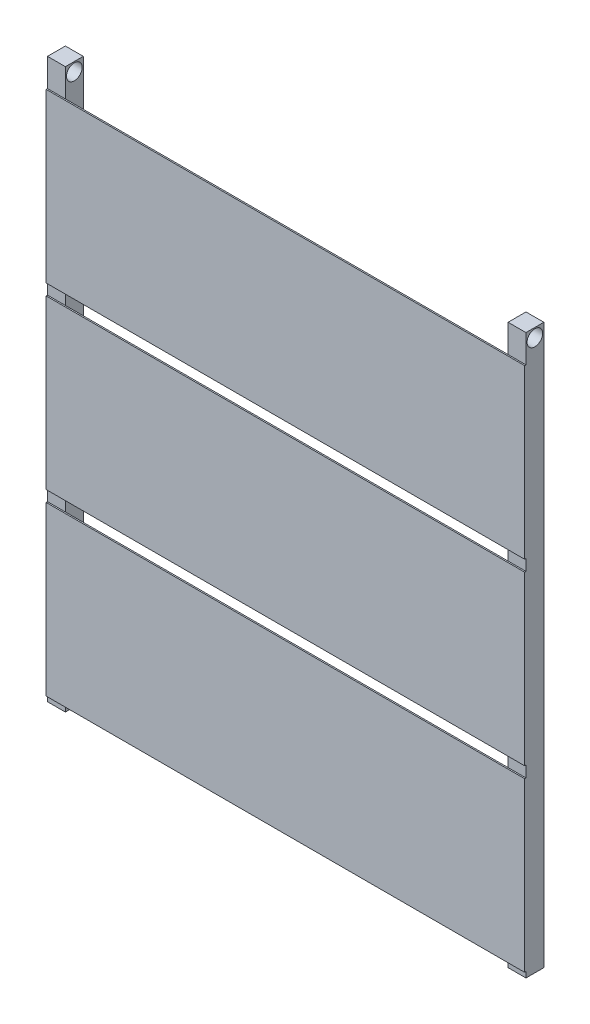
ISO-10303-21;
HEADER;
FILE_DESCRIPTION(('STEP AP214'),'2;1');
FILE_NAME('part.step','',(''),(''),'','','');
FILE_SCHEMA(('AUTOMOTIVE_DESIGN { 1 0 10303 214 1 1 1 1 }'));
ENDSEC;
DATA;
#1=APPLICATION_CONTEXT('core data for automotive mechanical design processes');
#2=APPLICATION_PROTOCOL_DEFINITION('international standard','automotive_design',2000,#1);
#3=PRODUCT_CONTEXT('',#1,'mechanical');
#4=PRODUCT('Part','Part','',(#3));
#5=PRODUCT_RELATED_PRODUCT_CATEGORY('part','',(#4));
#6=PRODUCT_DEFINITION_FORMATION('','',#4);
#7=PRODUCT_DEFINITION_CONTEXT('part definition',#1,'design');
#8=PRODUCT_DEFINITION('design','',#6,#7);
#9=PRODUCT_DEFINITION_SHAPE('','',#8);
#10=(LENGTH_UNIT() NAMED_UNIT(*) SI_UNIT(.MILLI.,.METRE.));
#11=(NAMED_UNIT(*) PLANE_ANGLE_UNIT() SI_UNIT($,.RADIAN.));
#12=(NAMED_UNIT(*) SI_UNIT($,.STERADIAN.) SOLID_ANGLE_UNIT());
#13=UNCERTAINTY_MEASURE_WITH_UNIT(LENGTH_MEASURE(1.E-05),#10,'distance_accuracy_value','');
#14=(GEOMETRIC_REPRESENTATION_CONTEXT(3) GLOBAL_UNCERTAINTY_ASSIGNED_CONTEXT((#13)) GLOBAL_UNIT_ASSIGNED_CONTEXT((#10,
#11,#12)) REPRESENTATION_CONTEXT('',''));
#15=CARTESIAN_POINT('',(0.,0.,0.));
#16=DIRECTION('',(0.,0.,1.));
#17=DIRECTION('',(1.,0.,0.));
#18=AXIS2_PLACEMENT_3D('',#15,#16,#17);
#19=CARTESIAN_POINT('',(214.,250.,11.4545454545454));
#20=DIRECTION('',(0.,0.,-1.));
#21=DIRECTION('',(-1.,0.,0.));
#22=AXIS2_PLACEMENT_3D('',#19,#20,#21);
#23=PLANE('',#22);
#24=DIRECTION('',(-1.,0.,0.));
#25=VECTOR('',#24,1.);
#26=CARTESIAN_POINT('',(-213.999999999997,-95.,11.4545454545455));
#27=LINE('',#26,#25);
#28=CARTESIAN_POINT('',(214.,-95.,11.4545454545454));
#29=VERTEX_POINT('',#28);
#30=CARTESIAN_POINT('',(198.,-95.,11.4545454545454));
#31=VERTEX_POINT('',#30);
#32=EDGE_CURVE('E76',#29,#31,#27,.T.);
#33=ORIENTED_EDGE('',*,*,#32,.F.);
#34=DIRECTION('',(0.,-1.,0.));
#35=VECTOR('',#34,1.);
#36=CARTESIAN_POINT('',(214.,250.,11.4545454545454));
#37=LINE('',#36,#35);
#38=CARTESIAN_POINT('',(214.,-85.,11.4545454545454));
#39=VERTEX_POINT('',#38);
#40=EDGE_CURVE('E211',#39,#29,#37,.T.);
#41=ORIENTED_EDGE('',*,*,#40,.F.);
#42=DIRECTION('',(1.,0.,0.));
#43=VECTOR('',#42,1.);
#44=CARTESIAN_POINT('',(-213.999999999998,-85.,11.4545454545455));
#45=LINE('',#44,#43);
#46=CARTESIAN_POINT('',(198.,-85.,11.4545454545455));
#47=VERTEX_POINT('',#46);
#48=EDGE_CURVE('E243',#47,#39,#45,.T.);
#49=ORIENTED_EDGE('',*,*,#48,.F.);
#50=DIRECTION('',(0.,-1.,0.));
#51=VECTOR('',#50,1.);
#52=CARTESIAN_POINT('',(198.,250.,11.4545454545454));
#53=LINE('',#52,#51);
#54=EDGE_CURVE('E393',#47,#31,#53,.T.);
#55=ORIENTED_EDGE('',*,*,#54,.T.);
#56=EDGE_LOOP('',(#33,#41,#49,#55));
#57=FACE_BOUND('',#56,.T.);
#58=ADVANCED_FACE('F49',(#57),#23,.F.);
#59=DIRECTION('',(1.,0.,0.));
#60=VECTOR('',#59,1.);
#61=CARTESIAN_POINT('',(-213.999999999997,-245.,11.4545454545455));
#62=LINE('',#61,#60);
#63=CARTESIAN_POINT('',(198.,-245.,11.4545454545455));
#64=VERTEX_POINT('',#63);
#65=CARTESIAN_POINT('',(214.,-245.,11.4545454545454));
#66=VERTEX_POINT('',#65);
#67=EDGE_CURVE('E471',#64,#66,#62,.T.);
#68=ORIENTED_EDGE('',*,*,#67,.F.);
#69=CARTESIAN_POINT('',(198.,-250.,11.4545454545454));
#70=VERTEX_POINT('',#69);
#71=EDGE_CURVE('E330',#64,#70,#53,.T.);
#72=ORIENTED_EDGE('',*,*,#71,.T.);
#73=DIRECTION('',(1.,0.,0.));
#74=VECTOR('',#73,1.);
#75=CARTESIAN_POINT('',(214.,-250.,11.4545454545454));
#76=LINE('',#75,#74);
#77=CARTESIAN_POINT('',(214.,-250.,11.4545454545454));
#78=VERTEX_POINT('',#77);
#79=EDGE_CURVE('E306',#70,#78,#76,.T.);
#80=ORIENTED_EDGE('',*,*,#79,.T.);
#81=EDGE_CURVE('E68',#66,#78,#37,.T.);
#82=ORIENTED_EDGE('',*,*,#81,.F.);
#83=EDGE_LOOP('',(#68,#72,#80,#82));
#84=FACE_BOUND('',#83,.T.);
#85=ADVANCED_FACE('F432',(#84),#23,.F.);
#86=DIRECTION('',(-1.,0.,0.));
#87=VECTOR('',#86,1.);
#88=CARTESIAN_POINT('',(-213.999999999998,65.,11.4545454545455));
#89=LINE('',#88,#87);
#90=CARTESIAN_POINT('',(214.,65.,11.4545454545454));
#91=VERTEX_POINT('',#90);
#92=CARTESIAN_POINT('',(198.,65.,11.4545454545454));
#93=VERTEX_POINT('',#92);
#94=EDGE_CURVE('E217',#91,#93,#89,.T.);
#95=ORIENTED_EDGE('',*,*,#94,.F.);
#96=CARTESIAN_POINT('',(214.,75.,11.4545454545454));
#97=VERTEX_POINT('',#96);
#98=EDGE_CURVE('E331',#97,#91,#37,.T.);
#99=ORIENTED_EDGE('',*,*,#98,.F.);
#100=DIRECTION('',(1.,0.,0.));
#101=VECTOR('',#100,1.);
#102=CARTESIAN_POINT('',(-214.,75.,11.4545454545455));
#103=LINE('',#102,#101);
#104=CARTESIAN_POINT('',(198.,75.,11.4545454545454));
#105=VERTEX_POINT('',#104);
#106=EDGE_CURVE('E12',#105,#97,#103,.T.);
#107=ORIENTED_EDGE('',*,*,#106,.F.);
#108=EDGE_CURVE('E380',#105,#93,#53,.T.);
#109=ORIENTED_EDGE('',*,*,#108,.T.);
#110=EDGE_LOOP('',(#95,#99,#107,#109));
#111=FACE_BOUND('',#110,.T.);
#112=ADVANCED_FACE('F379',(#111),#23,.F.);
#113=DIRECTION('',(-1.,0.,0.));
#114=VECTOR('',#113,1.);
#115=CARTESIAN_POINT('',(-214.,225.,11.4545454545455));
#116=LINE('',#115,#114);
#117=CARTESIAN_POINT('',(214.,225.,11.4545454545454));
#118=VERTEX_POINT('',#117);
#119=CARTESIAN_POINT('',(198.,225.,11.4545454545455));
#120=VERTEX_POINT('',#119);
#121=EDGE_CURVE('E276',#118,#120,#116,.T.);
#122=ORIENTED_EDGE('',*,*,#121,.F.);
#123=CARTESIAN_POINT('',(214.,250.,11.4545454545454));
#124=VERTEX_POINT('',#123);
#125=EDGE_CURVE('E326',#124,#118,#37,.T.);
#126=ORIENTED_EDGE('',*,*,#125,.F.);
#127=DIRECTION('',(1.,0.,0.));
#128=VECTOR('',#127,1.);
#129=CARTESIAN_POINT('',(214.,250.,11.4545454545454));
#130=LINE('',#129,#128);
#131=CARTESIAN_POINT('',(198.,250.,11.4545454545454));
#132=VERTEX_POINT('',#131);
#133=EDGE_CURVE('E312',#132,#124,#130,.T.);
#134=ORIENTED_EDGE('',*,*,#133,.F.);
#135=EDGE_CURVE('E332',#132,#120,#53,.T.);
#136=ORIENTED_EDGE('',*,*,#135,.T.);
#137=EDGE_LOOP('',(#122,#126,#134,#136));
#138=FACE_BOUND('',#137,.T.);
#139=ADVANCED_FACE('F437',(#138),#23,.F.);
#140=CARTESIAN_POINT('',(214.,250.,11.4545454545454));
#141=DIRECTION('',(-1.,0.,0.));
#142=DIRECTION('',(0.,0.,1.));
#143=AXIS2_PLACEMENT_3D('',#140,#141,#142);
#144=PLANE('',#143);
#145=CARTESIAN_POINT('',(214.000000000003,242.,3.45454545454541));
#146=DIRECTION('',(1.,0.,0.));
#147=DIRECTION('',(0.,0.,-1.));
#148=AXIS2_PLACEMENT_3D('',#145,#146,#147);
#149=CIRCLE('',#148,7.);
#150=CARTESIAN_POINT('',(214.000000000003,242.,10.4545454545454));
#151=VERTEX_POINT('',#150);
#152=EDGE_CURVE('E453',#151,#151,#149,.T.);
#153=ORIENTED_EDGE('',*,*,#152,.F.);
#154=EDGE_LOOP('',(#153));
#155=FACE_BOUND('',#154,.T.);
#156=DIRECTION('',(0.,0.,-1.));
#157=VECTOR('',#156,1.);
#158=CARTESIAN_POINT('',(214.,-250.,11.4545454545454));
#159=LINE('',#158,#157);
#160=CARTESIAN_POINT('',(214.,-250.,-4.54545454545459));
#161=VERTEX_POINT('',#160);
#162=EDGE_CURVE('E300',#78,#161,#159,.T.);
#163=ORIENTED_EDGE('',*,*,#162,.T.);
#164=DIRECTION('',(0.,-1.,0.));
#165=VECTOR('',#164,1.);
#166=CARTESIAN_POINT('',(214.,250.,-4.54545454545459));
#167=LINE('',#166,#165);
#168=CARTESIAN_POINT('',(214.,250.,-4.54545454545459));
#169=VERTEX_POINT('',#168);
#170=EDGE_CURVE('E59',#169,#161,#167,.T.);
#171=ORIENTED_EDGE('',*,*,#170,.F.);
#172=DIRECTION('',(0.,0.,-1.));
#173=VECTOR('',#172,1.);
#174=CARTESIAN_POINT('',(214.,250.,11.4545454545454));
#175=LINE('',#174,#173);
#176=EDGE_CURVE('E301',#124,#169,#175,.T.);
#177=ORIENTED_EDGE('',*,*,#176,.F.);
#178=ORIENTED_EDGE('',*,*,#125,.T.);
#179=DIRECTION('',(0.,0.,-1.));
#180=VECTOR('',#179,1.);
#181=CARTESIAN_POINT('',(214.,225.,12.6545454545455));
#182=LINE('',#181,#180);
#183=CARTESIAN_POINT('',(214.,225.,12.6545454545455));
#184=VERTEX_POINT('',#183);
#185=EDGE_CURVE('E296',#184,#118,#182,.T.);
#186=ORIENTED_EDGE('',*,*,#185,.F.);
#187=DIRECTION('',(0.,1.,0.));
#188=VECTOR('',#187,1.);
#189=CARTESIAN_POINT('',(214.,75.,12.6545454545455));
#190=LINE('',#189,#188);
#191=CARTESIAN_POINT('',(214.,75.,12.6545454545455));
#192=VERTEX_POINT('',#191);
#193=EDGE_CURVE('E262',#192,#184,#190,.T.);
#194=ORIENTED_EDGE('',*,*,#193,.F.);
#195=DIRECTION('',(0.,0.,-1.));
#196=VECTOR('',#195,1.);
#197=CARTESIAN_POINT('',(214.,75.,12.6545454545455));
#198=LINE('',#197,#196);
#199=EDGE_CURVE('E275',#192,#97,#198,.T.);
#200=ORIENTED_EDGE('',*,*,#199,.T.);
#201=ORIENTED_EDGE('',*,*,#98,.T.);
#202=DIRECTION('',(0.,0.,-1.));
#203=VECTOR('',#202,1.);
#204=CARTESIAN_POINT('',(214.000000000002,65.,12.6545454545455));
#205=LINE('',#204,#203);
#206=CARTESIAN_POINT('',(214.000000000002,65.,12.6545454545455));
#207=VERTEX_POINT('',#206);
#208=EDGE_CURVE('E257',#207,#91,#205,.T.);
#209=ORIENTED_EDGE('',*,*,#208,.F.);
#210=DIRECTION('',(0.,1.,0.));
#211=VECTOR('',#210,1.);
#212=CARTESIAN_POINT('',(214.000000000002,-85.,12.6545454545455));
#213=LINE('',#212,#211);
#214=CARTESIAN_POINT('',(214.000000000002,-85.,12.6545454545455));
#215=VERTEX_POINT('',#214);
#216=EDGE_CURVE('E223',#215,#207,#213,.T.);
#217=ORIENTED_EDGE('',*,*,#216,.F.);
#218=DIRECTION('',(0.,0.,-1.));
#219=VECTOR('',#218,1.);
#220=CARTESIAN_POINT('',(214.000000000002,-85.,12.6545454545455));
#221=LINE('',#220,#219);
#222=EDGE_CURVE('E236',#215,#39,#221,.T.);
#223=ORIENTED_EDGE('',*,*,#222,.T.);
#224=ORIENTED_EDGE('',*,*,#40,.T.);
#225=DIRECTION('',(0.,0.,-1.));
#226=VECTOR('',#225,1.);
#227=CARTESIAN_POINT('',(214.000000000003,-95.,12.6545454545455));
#228=LINE('',#227,#226);
#229=CARTESIAN_POINT('',(214.000000000003,-95.,12.6545454545455));
#230=VERTEX_POINT('',#229);
#231=EDGE_CURVE('E190',#230,#29,#228,.T.);
#232=ORIENTED_EDGE('',*,*,#231,.F.);
#233=DIRECTION('',(0.,1.,0.));
#234=VECTOR('',#233,1.);
#235=CARTESIAN_POINT('',(214.000000000003,-245.,12.6545454545455));
#236=LINE('',#235,#234);
#237=CARTESIAN_POINT('',(214.000000000003,-245.,12.6545454545455));
#238=VERTEX_POINT('',#237);
#239=EDGE_CURVE('E197',#238,#230,#236,.T.);
#240=ORIENTED_EDGE('',*,*,#239,.F.);
#241=DIRECTION('',(0.,0.,-1.));
#242=VECTOR('',#241,1.);
#243=CARTESIAN_POINT('',(214.000000000003,-245.,12.6545454545455));
#244=LINE('',#243,#242);
#245=EDGE_CURVE('E465',#238,#66,#244,.T.);
#246=ORIENTED_EDGE('',*,*,#245,.T.);
#247=ORIENTED_EDGE('',*,*,#81,.T.);
#248=EDGE_LOOP('',(#163,#171,#177,#178,#186,#194,#200,#201,#209,#217,#223,#224,#232,#240,#246,#247));
#249=FACE_BOUND('',#248,.T.);
#250=ADVANCED_FACE('F51',(#155,#249),#144,.F.);
#251=CARTESIAN_POINT('',(214.,250.,-4.54545454545459));
#252=DIRECTION('',(0.,0.,1.));
#253=DIRECTION('',(1.,0.,0.));
#254=AXIS2_PLACEMENT_3D('',#251,#252,#253);
#255=PLANE('',#254);
#256=DIRECTION('',(-1.,0.,0.));
#257=VECTOR('',#256,1.);
#258=CARTESIAN_POINT('',(214.,-250.,-4.54545454545459));
#259=LINE('',#258,#257);
#260=CARTESIAN_POINT('',(198.,-250.,-4.54545454545459));
#261=VERTEX_POINT('',#260);
#262=EDGE_CURVE('E317',#161,#261,#259,.T.);
#263=ORIENTED_EDGE('',*,*,#262,.T.);
#264=DIRECTION('',(0.,-1.,0.));
#265=VECTOR('',#264,1.);
#266=CARTESIAN_POINT('',(198.,250.,-4.54545454545459));
#267=LINE('',#266,#265);
#268=CARTESIAN_POINT('',(198.,250.,-4.54545454545459));
#269=VERTEX_POINT('',#268);
#270=EDGE_CURVE('E335',#269,#261,#267,.T.);
#271=ORIENTED_EDGE('',*,*,#270,.F.);
#272=DIRECTION('',(-1.,0.,0.));
#273=VECTOR('',#272,1.);
#274=CARTESIAN_POINT('',(214.,250.,-4.54545454545459));
#275=LINE('',#274,#273);
#276=EDGE_CURVE('E305',#169,#269,#275,.T.);
#277=ORIENTED_EDGE('',*,*,#276,.F.);
#278=ORIENTED_EDGE('',*,*,#170,.T.);
#279=EDGE_LOOP('',(#263,#271,#277,#278));
#280=FACE_BOUND('',#279,.T.);
#281=ADVANCED_FACE('F343',(#280),#255,.F.);
#282=CARTESIAN_POINT('',(198.,250.,11.4545454545454));
#283=DIRECTION('',(1.,0.,0.));
#284=DIRECTION('',(0.,0.,-1.));
#285=AXIS2_PLACEMENT_3D('',#282,#283,#284);
#286=PLANE('',#285);
#287=CARTESIAN_POINT('',(198.,242.,3.45454545454541));
#288=DIRECTION('',(1.,0.,0.));
#289=DIRECTION('',(0.,0.,-1.));
#290=AXIS2_PLACEMENT_3D('',#287,#288,#289);
#291=CIRCLE('',#290,7.);
#292=CARTESIAN_POINT('',(198.,242.,10.4545454545454));
#293=VERTEX_POINT('',#292);
#294=EDGE_CURVE('E53',#293,#293,#291,.F.);
#295=ORIENTED_EDGE('',*,*,#294,.F.);
#296=EDGE_LOOP('',(#295));
#297=FACE_BOUND('',#296,.T.);
#298=DIRECTION('',(0.,0.,1.));
#299=VECTOR('',#298,1.);
#300=CARTESIAN_POINT('',(198.,-250.,11.4545454545454));
#301=LINE('',#300,#299);
#302=EDGE_CURVE('E320',#261,#70,#301,.T.);
#303=ORIENTED_EDGE('',*,*,#302,.T.);
#304=ORIENTED_EDGE('',*,*,#71,.F.);
#305=EDGE_CURVE('E395',#31,#64,#53,.T.);
#306=ORIENTED_EDGE('',*,*,#305,.F.);
#307=ORIENTED_EDGE('',*,*,#54,.F.);
#308=EDGE_CURVE('E385',#93,#47,#53,.T.);
#309=ORIENTED_EDGE('',*,*,#308,.F.);
#310=ORIENTED_EDGE('',*,*,#108,.F.);
#311=EDGE_CURVE('E336',#120,#105,#53,.T.);
#312=ORIENTED_EDGE('',*,*,#311,.F.);
#313=ORIENTED_EDGE('',*,*,#135,.F.);
#314=DIRECTION('',(0.,0.,1.));
#315=VECTOR('',#314,1.);
#316=CARTESIAN_POINT('',(198.,250.,11.4545454545454));
#317=LINE('',#316,#315);
#318=EDGE_CURVE('E309',#269,#132,#317,.T.);
#319=ORIENTED_EDGE('',*,*,#318,.F.);
#320=ORIENTED_EDGE('',*,*,#270,.T.);
#321=EDGE_LOOP('',(#303,#304,#306,#307,#309,#310,#312,#313,#319,#320));
#322=FACE_BOUND('',#321,.T.);
#323=ADVANCED_FACE('F352',(#297,#322),#286,.F.);
#324=CARTESIAN_POINT('',(0.,250.,0.));
#325=DIRECTION('',(0.,1.,0.));
#326=DIRECTION('',(0.,0.,1.));
#327=AXIS2_PLACEMENT_3D('',#324,#325,#326);
#328=PLANE('',#327);
#329=ORIENTED_EDGE('',*,*,#176,.T.);
#330=ORIENTED_EDGE('',*,*,#276,.T.);
#331=ORIENTED_EDGE('',*,*,#318,.T.);
#332=ORIENTED_EDGE('',*,*,#133,.T.);
#333=EDGE_LOOP('',(#329,#330,#331,#332));
#334=FACE_BOUND('',#333,.T.);
#335=ADVANCED_FACE('F358',(#334),#328,.T.);
#336=CARTESIAN_POINT('',(0.,-250.,0.));
#337=DIRECTION('',(0.,1.,0.));
#338=DIRECTION('',(0.,0.,1.));
#339=AXIS2_PLACEMENT_3D('',#336,#337,#338);
#340=PLANE('',#339);
#341=ORIENTED_EDGE('',*,*,#162,.F.);
#342=ORIENTED_EDGE('',*,*,#79,.F.);
#343=ORIENTED_EDGE('',*,*,#302,.F.);
#344=ORIENTED_EDGE('',*,*,#262,.F.);
#345=EDGE_LOOP('',(#341,#342,#343,#344));
#346=FACE_BOUND('',#345,.T.);
#347=ADVANCED_FACE('F349',(#346),#340,.F.);
#348=CARTESIAN_POINT('',(-214.,225.,12.6545454545455));
#349=DIRECTION('',(0.,-1.,0.));
#350=DIRECTION('',(0.,0.,-1.));
#351=AXIS2_PLACEMENT_3D('',#348,#349,#350);
#352=PLANE('',#351);
#353=ORIENTED_EDGE('',*,*,#121,.T.);
#354=CARTESIAN_POINT('',(-214.,225.,11.4545454545455));
#355=VERTEX_POINT('',#354);
#356=EDGE_CURVE('E261',#120,#355,#116,.T.);
#357=ORIENTED_EDGE('',*,*,#356,.T.);
#358=DIRECTION('',(0.,0.,-1.));
#359=VECTOR('',#358,1.);
#360=CARTESIAN_POINT('',(-214.,225.,12.6545454545455));
#361=LINE('',#360,#359);
#362=CARTESIAN_POINT('',(-214.,225.,12.6545454545455));
#363=VERTEX_POINT('',#362);
#364=EDGE_CURVE('E292',#363,#355,#361,.T.);
#365=ORIENTED_EDGE('',*,*,#364,.F.);
#366=DIRECTION('',(-1.,0.,0.));
#367=VECTOR('',#366,1.);
#368=CARTESIAN_POINT('',(-214.,225.,12.6545454545455));
#369=LINE('',#368,#367);
#370=EDGE_CURVE('E266',#184,#363,#369,.T.);
#371=ORIENTED_EDGE('',*,*,#370,.F.);
#372=ORIENTED_EDGE('',*,*,#185,.T.);
#373=EDGE_LOOP('',(#353,#357,#365,#371,#372));
#374=FACE_BOUND('',#373,.T.);
#375=ADVANCED_FACE('F364',(#374),#352,.F.);
#376=CARTESIAN_POINT('',(-214.,75.,12.6545454545455));
#377=DIRECTION('',(1.,0.,0.));
#378=DIRECTION('',(0.,0.,-1.));
#379=AXIS2_PLACEMENT_3D('',#376,#377,#378);
#380=PLANE('',#379);
#381=DIRECTION('',(0.,-1.,0.));
#382=VECTOR('',#381,1.);
#383=CARTESIAN_POINT('',(-214.,75.,11.4545454545455));
#384=LINE('',#383,#382);
#385=CARTESIAN_POINT('',(-214.,75.,11.4545454545455));
#386=VERTEX_POINT('',#385);
#387=EDGE_CURVE('E280',#355,#386,#384,.T.);
#388=ORIENTED_EDGE('',*,*,#387,.T.);
#389=DIRECTION('',(0.,0.,-1.));
#390=VECTOR('',#389,1.);
#391=CARTESIAN_POINT('',(-214.,75.,12.6545454545455));
#392=LINE('',#391,#390);
#393=CARTESIAN_POINT('',(-214.,75.,12.6545454545455));
#394=VERTEX_POINT('',#393);
#395=EDGE_CURVE('E288',#394,#386,#392,.T.);
#396=ORIENTED_EDGE('',*,*,#395,.F.);
#397=DIRECTION('',(0.,-1.,0.));
#398=VECTOR('',#397,1.);
#399=CARTESIAN_POINT('',(-214.,75.,12.6545454545455));
#400=LINE('',#399,#398);
#401=EDGE_CURVE('E269',#363,#394,#400,.T.);
#402=ORIENTED_EDGE('',*,*,#401,.F.);
#403=ORIENTED_EDGE('',*,*,#364,.T.);
#404=EDGE_LOOP('',(#388,#396,#402,#403));
#405=FACE_BOUND('',#404,.T.);
#406=ADVANCED_FACE('F514',(#405),#380,.F.);
#407=CARTESIAN_POINT('',(-214.,75.,12.6545454545455));
#408=DIRECTION('',(0.,1.,0.));
#409=DIRECTION('',(0.,0.,1.));
#410=AXIS2_PLACEMENT_3D('',#407,#408,#409);
#411=PLANE('',#410);
#412=EDGE_CURVE('E61',#386,#105,#103,.T.);
#413=ORIENTED_EDGE('',*,*,#412,.T.);
#414=ORIENTED_EDGE('',*,*,#106,.T.);
#415=ORIENTED_EDGE('',*,*,#199,.F.);
#416=DIRECTION('',(1.,0.,0.));
#417=VECTOR('',#416,1.);
#418=CARTESIAN_POINT('',(-214.,75.,12.6545454545455));
#419=LINE('',#418,#417);
#420=EDGE_CURVE('E272',#394,#192,#419,.T.);
#421=ORIENTED_EDGE('',*,*,#420,.F.);
#422=ORIENTED_EDGE('',*,*,#395,.T.);
#423=EDGE_LOOP('',(#413,#414,#415,#421,#422));
#424=FACE_BOUND('',#423,.T.);
#425=ADVANCED_FACE('F374',(#424),#411,.F.);
#426=CARTESIAN_POINT('',(0.,0.,12.6545454545455));
#427=DIRECTION('',(0.,0.,-1.));
#428=DIRECTION('',(-1.,0.,0.));
#429=AXIS2_PLACEMENT_3D('',#426,#427,#428);
#430=PLANE('',#429);
#431=ORIENTED_EDGE('',*,*,#193,.T.);
#432=ORIENTED_EDGE('',*,*,#370,.T.);
#433=ORIENTED_EDGE('',*,*,#401,.T.);
#434=ORIENTED_EDGE('',*,*,#420,.T.);
#435=EDGE_LOOP('',(#431,#432,#433,#434));
#436=FACE_BOUND('',#435,.T.);
#437=ADVANCED_FACE('F368',(#436),#430,.F.);
#438=CARTESIAN_POINT('',(0.,0.,11.4545454545455));
#439=DIRECTION('',(0.,0.,-1.));
#440=DIRECTION('',(-1.,0.,0.));
#441=AXIS2_PLACEMENT_3D('',#438,#439,#440);
#442=PLANE('',#441);
#443=ORIENTED_EDGE('',*,*,#356,.F.);
#444=ORIENTED_EDGE('',*,*,#311,.T.);
#445=ORIENTED_EDGE('',*,*,#412,.F.);
#446=ORIENTED_EDGE('',*,*,#387,.F.);
#447=EDGE_LOOP('',(#443,#444,#445,#446));
#448=FACE_BOUND('',#447,.T.);
#449=ADVANCED_FACE('F388',(#448),#442,.T.);
#450=CARTESIAN_POINT('',(0.,0.,11.4545454545455));
#451=DIRECTION('',(0.,0.,-1.));
#452=DIRECTION('',(-1.,0.,0.));
#453=AXIS2_PLACEMENT_3D('',#450,#451,#452);
#454=PLANE('',#453);
#455=ORIENTED_EDGE('',*,*,#308,.T.);
#456=CARTESIAN_POINT('',(-213.999999999998,-85.,11.4545454545455));
#457=VERTEX_POINT('',#456);
#458=EDGE_CURVE('E228',#457,#47,#45,.T.);
#459=ORIENTED_EDGE('',*,*,#458,.F.);
#460=DIRECTION('',(0.,-1.,0.));
#461=VECTOR('',#460,1.);
#462=CARTESIAN_POINT('',(-213.999999999998,-85.,11.4545454545455));
#463=LINE('',#462,#461);
#464=CARTESIAN_POINT('',(-213.999999999998,65.,11.4545454545455));
#465=VERTEX_POINT('',#464);
#466=EDGE_CURVE('E240',#465,#457,#463,.T.);
#467=ORIENTED_EDGE('',*,*,#466,.F.);
#468=EDGE_CURVE('E213',#93,#465,#89,.T.);
#469=ORIENTED_EDGE('',*,*,#468,.F.);
#470=EDGE_LOOP('',(#455,#459,#467,#469));
#471=FACE_BOUND('',#470,.T.);
#472=ADVANCED_FACE('F419',(#471),#454,.T.);
#473=CARTESIAN_POINT('',(-213.999999999998,65.,12.6545454545455));
#474=DIRECTION('',(0.,-1.,0.));
#475=DIRECTION('',(0.,0.,-1.));
#476=AXIS2_PLACEMENT_3D('',#473,#474,#475);
#477=PLANE('',#476);
#478=ORIENTED_EDGE('',*,*,#94,.T.);
#479=ORIENTED_EDGE('',*,*,#468,.T.);
#480=DIRECTION('',(0.,0.,-1.));
#481=VECTOR('',#480,1.);
#482=CARTESIAN_POINT('',(-213.999999999998,65.,12.6545454545455));
#483=LINE('',#482,#481);
#484=CARTESIAN_POINT('',(-213.999999999998,65.,12.6545454545455));
#485=VERTEX_POINT('',#484);
#486=EDGE_CURVE('E253',#485,#465,#483,.T.);
#487=ORIENTED_EDGE('',*,*,#486,.F.);
#488=DIRECTION('',(-1.,0.,0.));
#489=VECTOR('',#488,1.);
#490=CARTESIAN_POINT('',(-213.999999999998,65.,12.6545454545455));
#491=LINE('',#490,#489);
#492=EDGE_CURVE('E227',#207,#485,#491,.T.);
#493=ORIENTED_EDGE('',*,*,#492,.F.);
#494=ORIENTED_EDGE('',*,*,#208,.T.);
#495=EDGE_LOOP('',(#478,#479,#487,#493,#494));
#496=FACE_BOUND('',#495,.T.);
#497=ADVANCED_FACE('F421',(#496),#477,.F.);
#498=CARTESIAN_POINT('',(-213.999999999998,-85.,12.6545454545455));
#499=DIRECTION('',(1.,0.,0.));
#500=DIRECTION('',(0.,0.,-1.));
#501=AXIS2_PLACEMENT_3D('',#498,#499,#500);
#502=PLANE('',#501);
#503=ORIENTED_EDGE('',*,*,#466,.T.);
#504=DIRECTION('',(0.,0.,-1.));
#505=VECTOR('',#504,1.);
#506=CARTESIAN_POINT('',(-213.999999999998,-85.,12.6545454545455));
#507=LINE('',#506,#505);
#508=CARTESIAN_POINT('',(-213.999999999998,-85.,12.6545454545455));
#509=VERTEX_POINT('',#508);
#510=EDGE_CURVE('E249',#509,#457,#507,.T.);
#511=ORIENTED_EDGE('',*,*,#510,.F.);
#512=DIRECTION('',(0.,-1.,0.));
#513=VECTOR('',#512,1.);
#514=CARTESIAN_POINT('',(-213.999999999998,-85.,12.6545454545455));
#515=LINE('',#514,#513);
#516=EDGE_CURVE('E231',#485,#509,#515,.T.);
#517=ORIENTED_EDGE('',*,*,#516,.F.);
#518=ORIENTED_EDGE('',*,*,#486,.T.);
#519=EDGE_LOOP('',(#503,#511,#517,#518));
#520=FACE_BOUND('',#519,.T.);
#521=ADVANCED_FACE('F422',(#520),#502,.F.);
#522=CARTESIAN_POINT('',(-213.999999999998,-85.,12.6545454545455));
#523=DIRECTION('',(0.,1.,0.));
#524=DIRECTION('',(0.,0.,1.));
#525=AXIS2_PLACEMENT_3D('',#522,#523,#524);
#526=PLANE('',#525);
#527=ORIENTED_EDGE('',*,*,#458,.T.);
#528=ORIENTED_EDGE('',*,*,#48,.T.);
#529=ORIENTED_EDGE('',*,*,#222,.F.);
#530=DIRECTION('',(1.,0.,0.));
#531=VECTOR('',#530,1.);
#532=CARTESIAN_POINT('',(-213.999999999998,-85.,12.6545454545455));
#533=LINE('',#532,#531);
#534=EDGE_CURVE('E234',#509,#215,#533,.T.);
#535=ORIENTED_EDGE('',*,*,#534,.F.);
#536=ORIENTED_EDGE('',*,*,#510,.T.);
#537=EDGE_LOOP('',(#527,#528,#529,#535,#536));
#538=FACE_BOUND('',#537,.T.);
#539=ADVANCED_FACE('F407',(#538),#526,.F.);
#540=CARTESIAN_POINT('',(0.,0.,12.6545454545455));
#541=DIRECTION('',(0.,0.,-1.));
#542=DIRECTION('',(-1.,0.,0.));
#543=AXIS2_PLACEMENT_3D('',#540,#541,#542);
#544=PLANE('',#543);
#545=ORIENTED_EDGE('',*,*,#216,.T.);
#546=ORIENTED_EDGE('',*,*,#492,.T.);
#547=ORIENTED_EDGE('',*,*,#516,.T.);
#548=ORIENTED_EDGE('',*,*,#534,.T.);
#549=EDGE_LOOP('',(#545,#546,#547,#548));
#550=FACE_BOUND('',#549,.T.);
#551=ADVANCED_FACE('F412',(#550),#544,.F.);
#552=CARTESIAN_POINT('',(0.,0.,11.4545454545455));
#553=DIRECTION('',(0.,0.,-1.));
#554=DIRECTION('',(-1.,0.,0.));
#555=AXIS2_PLACEMENT_3D('',#552,#553,#554);
#556=PLANE('',#555);
#557=ORIENTED_EDGE('',*,*,#305,.T.);
#558=CARTESIAN_POINT('',(-213.999999999997,-245.,11.4545454545455));
#559=VERTEX_POINT('',#558);
#560=EDGE_CURVE('E207',#559,#64,#62,.T.);
#561=ORIENTED_EDGE('',*,*,#560,.F.);
#562=DIRECTION('',(0.,-1.,0.));
#563=VECTOR('',#562,1.);
#564=CARTESIAN_POINT('',(-213.999999999997,-245.,11.4545454545455));
#565=LINE('',#564,#563);
#566=CARTESIAN_POINT('',(-213.999999999997,-95.,11.4545454545455));
#567=VERTEX_POINT('',#566);
#568=EDGE_CURVE('E468',#567,#559,#565,.T.);
#569=ORIENTED_EDGE('',*,*,#568,.F.);
#570=EDGE_CURVE('E459',#31,#567,#27,.T.);
#571=ORIENTED_EDGE('',*,*,#570,.F.);
#572=EDGE_LOOP('',(#557,#561,#569,#571));
#573=FACE_BOUND('',#572,.T.);
#574=ADVANCED_FACE('F485',(#573),#556,.T.);
#575=CARTESIAN_POINT('',(-213.999999999997,-95.,12.6545454545455));
#576=DIRECTION('',(0.,-1.,0.));
#577=DIRECTION('',(0.,0.,-1.));
#578=AXIS2_PLACEMENT_3D('',#575,#576,#577);
#579=PLANE('',#578);
#580=ORIENTED_EDGE('',*,*,#32,.T.);
#581=ORIENTED_EDGE('',*,*,#570,.T.);
#582=DIRECTION('',(0.,0.,-1.));
#583=VECTOR('',#582,1.);
#584=CARTESIAN_POINT('',(-213.999999999997,-95.,12.6545454545455));
#585=LINE('',#584,#583);
#586=CARTESIAN_POINT('',(-213.999999999997,-95.,12.6545454545455));
#587=VERTEX_POINT('',#586);
#588=EDGE_CURVE('E192',#587,#567,#585,.T.);
#589=ORIENTED_EDGE('',*,*,#588,.F.);
#590=DIRECTION('',(-1.,0.,0.));
#591=VECTOR('',#590,1.);
#592=CARTESIAN_POINT('',(-213.999999999997,-95.,12.6545454545455));
#593=LINE('',#592,#591);
#594=EDGE_CURVE('E186',#230,#587,#593,.T.);
#595=ORIENTED_EDGE('',*,*,#594,.F.);
#596=ORIENTED_EDGE('',*,*,#231,.T.);
#597=EDGE_LOOP('',(#580,#581,#589,#595,#596));
#598=FACE_BOUND('',#597,.T.);
#599=ADVANCED_FACE('F188',(#598),#579,.F.);
#600=CARTESIAN_POINT('',(-213.999999999997,-245.,12.6545454545455));
#601=DIRECTION('',(1.,0.,0.));
#602=DIRECTION('',(0.,0.,-1.));
#603=AXIS2_PLACEMENT_3D('',#600,#601,#602);
#604=PLANE('',#603);
#605=ORIENTED_EDGE('',*,*,#568,.T.);
#606=DIRECTION('',(0.,0.,-1.));
#607=VECTOR('',#606,1.);
#608=CARTESIAN_POINT('',(-213.999999999997,-245.,12.6545454545455));
#609=LINE('',#608,#607);
#610=CARTESIAN_POINT('',(-213.999999999997,-245.,12.6545454545455));
#611=VERTEX_POINT('',#610);
#612=EDGE_CURVE('E219',#611,#559,#609,.T.);
#613=ORIENTED_EDGE('',*,*,#612,.F.);
#614=DIRECTION('',(0.,-1.,0.));
#615=VECTOR('',#614,1.);
#616=CARTESIAN_POINT('',(-213.999999999997,-245.,12.6545454545455));
#617=LINE('',#616,#615);
#618=EDGE_CURVE('E196',#587,#611,#617,.T.);
#619=ORIENTED_EDGE('',*,*,#618,.F.);
#620=ORIENTED_EDGE('',*,*,#588,.T.);
#621=EDGE_LOOP('',(#605,#613,#619,#620));
#622=FACE_BOUND('',#621,.T.);
#623=ADVANCED_FACE('F489',(#622),#604,.F.);
#624=CARTESIAN_POINT('',(-213.999999999997,-245.,12.6545454545455));
#625=DIRECTION('',(0.,1.,0.));
#626=DIRECTION('',(0.,0.,1.));
#627=AXIS2_PLACEMENT_3D('',#624,#625,#626);
#628=PLANE('',#627);
#629=ORIENTED_EDGE('',*,*,#560,.T.);
#630=ORIENTED_EDGE('',*,*,#67,.T.);
#631=ORIENTED_EDGE('',*,*,#245,.F.);
#632=DIRECTION('',(1.,0.,0.));
#633=VECTOR('',#632,1.);
#634=CARTESIAN_POINT('',(-213.999999999997,-245.,12.6545454545455));
#635=LINE('',#634,#633);
#636=EDGE_CURVE('E202',#611,#238,#635,.T.);
#637=ORIENTED_EDGE('',*,*,#636,.F.);
#638=ORIENTED_EDGE('',*,*,#612,.T.);
#639=EDGE_LOOP('',(#629,#630,#631,#637,#638));
#640=FACE_BOUND('',#639,.T.);
#641=ADVANCED_FACE('F481',(#640),#628,.F.);
#642=CARTESIAN_POINT('',(0.,0.,12.6545454545455));
#643=DIRECTION('',(0.,0.,-1.));
#644=DIRECTION('',(-1.,0.,0.));
#645=AXIS2_PLACEMENT_3D('',#642,#643,#644);
#646=PLANE('',#645);
#647=ORIENTED_EDGE('',*,*,#239,.T.);
#648=ORIENTED_EDGE('',*,*,#594,.T.);
#649=ORIENTED_EDGE('',*,*,#618,.T.);
#650=ORIENTED_EDGE('',*,*,#636,.T.);
#651=EDGE_LOOP('',(#647,#648,#649,#650));
#652=FACE_BOUND('',#651,.T.);
#653=ADVANCED_FACE('F200',(#652),#646,.F.);
#654=CARTESIAN_POINT('',(214.000000000003,242.,3.45454545454541));
#655=DIRECTION('',(-1.,0.,0.));
#656=DIRECTION('',(0.,0.,1.));
#657=AXIS2_PLACEMENT_3D('',#654,#655,#656);
#658=CYLINDRICAL_SURFACE('',#657,7.);
#659=CARTESIAN_POINT('',(214.000000000003,242.,10.4545454545454));
#660=CARTESIAN_POINT('',(213.833333333337,242.,10.4545454545454));
#661=CARTESIAN_POINT('',(213.66666666667,242.,10.4545454545454));
#662=CARTESIAN_POINT('',(213.333333333337,242.,10.4545454545454));
#663=CARTESIAN_POINT('',(213.16666666667,242.,10.4545454545454));
#664=CARTESIAN_POINT('',(212.833333333337,242.,10.4545454545454));
#665=CARTESIAN_POINT('',(212.66666666667,242.,10.4545454545454));
#666=CARTESIAN_POINT('',(212.333333333336,242.,10.4545454545454));
#667=CARTESIAN_POINT('',(212.16666666667,242.,10.4545454545454));
#668=CARTESIAN_POINT('',(211.833333333336,242.,10.4545454545454));
#669=CARTESIAN_POINT('',(211.66666666667,242.,10.4545454545454));
#670=CARTESIAN_POINT('',(211.333333333336,242.,10.4545454545454));
#671=CARTESIAN_POINT('',(211.16666666667,242.,10.4545454545454));
#672=CARTESIAN_POINT('',(210.833333333336,242.,10.4545454545454));
#673=CARTESIAN_POINT('',(210.666666666669,242.,10.4545454545454));
#674=CARTESIAN_POINT('',(210.333333333336,242.,10.4545454545454));
#675=CARTESIAN_POINT('',(210.166666666669,242.,10.4545454545454));
#676=CARTESIAN_POINT('',(209.833333333336,242.,10.4545454545454));
#677=CARTESIAN_POINT('',(209.666666666669,242.,10.4545454545454));
#678=CARTESIAN_POINT('',(209.333333333336,242.,10.4545454545454));
#679=CARTESIAN_POINT('',(209.166666666669,242.,10.4545454545454));
#680=CARTESIAN_POINT('',(208.833333333336,242.,10.4545454545454));
#681=CARTESIAN_POINT('',(208.666666666669,242.,10.4545454545454));
#682=CARTESIAN_POINT('',(208.333333333336,242.,10.4545454545454));
#683=CARTESIAN_POINT('',(208.166666666669,242.,10.4545454545454));
#684=CARTESIAN_POINT('',(207.833333333335,242.,10.4545454545454));
#685=CARTESIAN_POINT('',(207.666666666669,242.,10.4545454545454));
#686=CARTESIAN_POINT('',(207.333333333335,242.,10.4545454545454));
#687=CARTESIAN_POINT('',(207.166666666669,242.,10.4545454545454));
#688=CARTESIAN_POINT('',(206.833333333335,242.,10.4545454545454));
#689=CARTESIAN_POINT('',(206.666666666669,242.,10.4545454545454));
#690=CARTESIAN_POINT('',(206.333333333335,242.,10.4545454545454));
#691=CARTESIAN_POINT('',(206.166666666668,242.,10.4545454545454));
#692=CARTESIAN_POINT('',(205.833333333335,242.,10.4545454545454));
#693=CARTESIAN_POINT('',(205.666666666668,242.,10.4545454545454));
#694=CARTESIAN_POINT('',(205.333333333335,242.,10.4545454545454));
#695=CARTESIAN_POINT('',(205.166666666668,242.,10.4545454545454));
#696=CARTESIAN_POINT('',(204.833333333335,242.,10.4545454545454));
#697=CARTESIAN_POINT('',(204.666666666668,242.,10.4545454545454));
#698=CARTESIAN_POINT('',(204.333333333335,242.,10.4545454545454));
#699=CARTESIAN_POINT('',(204.166666666668,242.,10.4545454545454));
#700=CARTESIAN_POINT('',(203.833333333335,242.,10.4545454545454));
#701=CARTESIAN_POINT('',(203.666666666668,242.,10.4545454545454));
#702=CARTESIAN_POINT('',(203.333333333335,242.,10.4545454545454));
#703=CARTESIAN_POINT('',(203.166666666668,242.,10.4545454545454));
#704=CARTESIAN_POINT('',(202.833333333334,242.,10.4545454545454));
#705=CARTESIAN_POINT('',(202.666666666668,242.,10.4545454545454));
#706=CARTESIAN_POINT('',(202.333333333334,242.,10.4545454545454));
#707=CARTESIAN_POINT('',(202.166666666668,242.,10.4545454545454));
#708=CARTESIAN_POINT('',(201.833333333334,242.,10.4545454545454));
#709=CARTESIAN_POINT('',(201.666666666667,242.,10.4545454545454));
#710=CARTESIAN_POINT('',(201.333333333334,242.,10.4545454545454));
#711=CARTESIAN_POINT('',(201.166666666667,242.,10.4545454545454));
#712=CARTESIAN_POINT('',(200.833333333334,242.,10.4545454545454));
#713=CARTESIAN_POINT('',(200.666666666667,242.,10.4545454545454));
#714=CARTESIAN_POINT('',(200.333333333334,242.,10.4545454545454));
#715=CARTESIAN_POINT('',(200.166666666667,242.,10.4545454545454));
#716=CARTESIAN_POINT('',(199.833333333334,242.,10.4545454545454));
#717=CARTESIAN_POINT('',(199.666666666667,242.,10.4545454545454));
#718=CARTESIAN_POINT('',(199.333333333334,242.,10.4545454545454));
#719=CARTESIAN_POINT('',(199.166666666667,242.,10.4545454545454));
#720=CARTESIAN_POINT('',(198.833333333334,242.,10.4545454545454));
#721=CARTESIAN_POINT('',(198.666666666667,242.,10.4545454545454));
#722=CARTESIAN_POINT('',(198.333333333333,242.,10.4545454545454));
#723=CARTESIAN_POINT('',(198.166666666667,242.,10.4545454545454));
#724=CARTESIAN_POINT('',(198.,242.,10.4545454545454));
#725=B_SPLINE_CURVE_WITH_KNOTS('',3,(#659,#660,#661,#662,#663,#664,#665,#666,#667,#668,#669,
#670,#671,#672,#673,#674,#675,#676,#677,#678,#679,#680,#681,#682,#683,#684,#685,#686,#687,#688,
#689,#690,#691,#692,#693,#694,#695,#696,#697,#698,#699,#700,#701,#702,#703,#704,#705,#706,#707,
#708,#709,#710,#711,#712,#713,#714,#715,#716,#717,#718,#719,#720,#721,#722,#723,#724),
.UNSPECIFIED.,.F.,.F.,(4,2,2,2,2,2,2,2,2,2,2,2,2,2,2,2,2,2,2,2,2,2,2,2,2,2,2,2,2,2,2,2,4),(0.,
0.500000000000111,1.00000000000022,1.50000000000033,2.00000000000045,2.50000000000056,
3.00000000000064,3.50000000000075,4.00000000000086,4.50000000000098,5.00000000000109,
5.50000000000117,6.00000000000128,6.50000000000139,7.0000000000015,7.50000000000162,
8.00000000000173,8.50000000000181,9.00000000000192,9.50000000000203,10.0000000000021,
10.5000000000023,11.0000000000023,11.5000000000025,12.0000000000026,12.5000000000027,
13.0000000000028,13.5000000000029,14.000000000003,14.5000000000031,15.0000000000032,
15.5000000000033,16.0000000000034),.UNSPECIFIED.);
#726=EDGE_CURVE('BSEAM604',#151,#293,#725,.T.);
#727=ORIENTED_EDGE('',*,*,#152,.T.);
#728=ORIENTED_EDGE('',*,*,#294,.T.);
#729=ORIENTED_EDGE('',*,*,#726,.T.);
#730=ORIENTED_EDGE('',*,*,#726,.F.);
#731=EDGE_LOOP('',(#727,#729,#728,#730));
#732=FACE_BOUND('',#731,.T.);
#733=ADVANCED_FACE('F604',(#732),#658,.F.);
#734=CLOSED_SHELL('',(#58,#85,#112,#139,#250,#281,#323,#335,#347,#375,#406,#425,#437,#449,#472,
#497,#521,#539,#551,#574,#599,#623,#641,#653,#733));
#735=MANIFOLD_SOLID_BREP('B2',#734);
#736=CARTESIAN_POINT('',(-198.,250.,11.4545454545455));
#737=DIRECTION('',(-1.,0.,0.));
#738=DIRECTION('',(0.,0.,1.));
#739=AXIS2_PLACEMENT_3D('',#736,#737,#738);
#740=PLANE('',#739);
#741=CARTESIAN_POINT('',(-198.,242.,3.45454545454541));
#742=DIRECTION('',(-1.,0.,0.));
#743=DIRECTION('',(0.,0.,1.));
#744=AXIS2_PLACEMENT_3D('',#741,#742,#743);
#745=CIRCLE('',#744,7.);
#746=CARTESIAN_POINT('',(-198.,242.,10.4545454545454));
#747=VERTEX_POINT('',#746);
#748=EDGE_CURVE('E745',#747,#747,#745,.F.);
#749=ORIENTED_EDGE('',*,*,#748,.F.);
#750=EDGE_LOOP('',(#749));
#751=FACE_BOUND('',#750,.T.);
#752=DIRECTION('',(0.,0.,-1.));
#753=VECTOR('',#752,1.);
#754=CARTESIAN_POINT('',(-198.,-250.,11.4545454545455));
#755=LINE('',#754,#753);
#756=CARTESIAN_POINT('',(-198.,-250.,11.4545454545455));
#757=VERTEX_POINT('',#756);
#758=CARTESIAN_POINT('',(-198.,-250.,-4.54545454545454));
#759=VERTEX_POINT('',#758);
#760=EDGE_CURVE('E742',#757,#759,#755,.T.);
#761=ORIENTED_EDGE('',*,*,#760,.T.);
#762=DIRECTION('',(0.,-1.,0.));
#763=VECTOR('',#762,1.);
#764=CARTESIAN_POINT('',(-198.,250.,-4.54545454545454));
#765=LINE('',#764,#763);
#766=CARTESIAN_POINT('',(-198.,250.,-4.54545454545454));
#767=VERTEX_POINT('',#766);
#768=EDGE_CURVE('E47',#767,#759,#765,.T.);
#769=ORIENTED_EDGE('',*,*,#768,.F.);
#770=DIRECTION('',(0.,0.,-1.));
#771=VECTOR('',#770,1.);
#772=CARTESIAN_POINT('',(-198.,250.,11.4545454545455));
#773=LINE('',#772,#771);
#774=CARTESIAN_POINT('',(-198.,250.,11.4545454545455));
#775=VERTEX_POINT('',#774);
#776=EDGE_CURVE('E730',#775,#767,#773,.T.);
#777=ORIENTED_EDGE('',*,*,#776,.F.);
#778=DIRECTION('',(0.,-1.,0.));
#779=VECTOR('',#778,1.);
#780=CARTESIAN_POINT('',(-198.,250.,11.4545454545455));
#781=LINE('',#780,#779);
#782=EDGE_CURVE('E738',#775,#757,#781,.T.);
#783=ORIENTED_EDGE('',*,*,#782,.T.);
#784=EDGE_LOOP('',(#761,#769,#777,#783));
#785=FACE_BOUND('',#784,.T.);
#786=ADVANCED_FACE('F679',(#751,#785),#740,.F.);
#787=CARTESIAN_POINT('',(-214.,250.,-4.54545454545454));
#788=DIRECTION('',(0.,0.,1.));
#789=DIRECTION('',(1.,0.,0.));
#790=AXIS2_PLACEMENT_3D('',#787,#788,#789);
#791=PLANE('',#790);
#792=DIRECTION('',(-1.,0.,0.));
#793=VECTOR('',#792,1.);
#794=CARTESIAN_POINT('',(-214.,-250.,-4.54545454545454));
#795=LINE('',#794,#793);
#796=CARTESIAN_POINT('',(-214.,-250.,-4.54545454545454));
#797=VERTEX_POINT('',#796);
#798=EDGE_CURVE('E734',#759,#797,#795,.T.);
#799=ORIENTED_EDGE('',*,*,#798,.T.);
#800=DIRECTION('',(0.,-1.,0.));
#801=VECTOR('',#800,1.);
#802=CARTESIAN_POINT('',(-214.,250.,-4.54545454545454));
#803=LINE('',#802,#801);
#804=CARTESIAN_POINT('',(-214.,250.,-4.54545454545454));
#805=VERTEX_POINT('',#804);
#806=EDGE_CURVE('E687',#805,#797,#803,.T.);
#807=ORIENTED_EDGE('',*,*,#806,.F.);
#808=DIRECTION('',(-1.,0.,0.));
#809=VECTOR('',#808,1.);
#810=CARTESIAN_POINT('',(-214.,250.,-4.54545454545454));
#811=LINE('',#810,#809);
#812=EDGE_CURVE('E725',#767,#805,#811,.T.);
#813=ORIENTED_EDGE('',*,*,#812,.F.);
#814=ORIENTED_EDGE('',*,*,#768,.T.);
#815=EDGE_LOOP('',(#799,#807,#813,#814));
#816=FACE_BOUND('',#815,.T.);
#817=ADVANCED_FACE('F733',(#816),#791,.F.);
#818=CARTESIAN_POINT('',(-214.,250.,11.4545454545455));
#819=DIRECTION('',(1.,0.,0.));
#820=DIRECTION('',(0.,0.,-1.));
#821=AXIS2_PLACEMENT_3D('',#818,#819,#820);
#822=PLANE('',#821);
#823=CARTESIAN_POINT('',(-214.,242.,3.45454545454541));
#824=DIRECTION('',(1.,0.,0.));
#825=DIRECTION('',(0.,0.,-1.));
#826=AXIS2_PLACEMENT_3D('',#823,#824,#825);
#827=CIRCLE('',#826,7.);
#828=CARTESIAN_POINT('',(-214.,242.,10.4545454545454));
#829=VERTEX_POINT('',#828);
#830=EDGE_CURVE('E758',#829,#829,#827,.T.);
#831=ORIENTED_EDGE('',*,*,#830,.T.);
#832=EDGE_LOOP('',(#831));
#833=FACE_BOUND('',#832,.T.);
#834=DIRECTION('',(0.,0.,1.));
#835=VECTOR('',#834,1.);
#836=CARTESIAN_POINT('',(-214.,-250.,11.4545454545455));
#837=LINE('',#836,#835);
#838=CARTESIAN_POINT('',(-214.,-250.,11.4545454545455));
#839=VERTEX_POINT('',#838);
#840=EDGE_CURVE('E712',#797,#839,#837,.T.);
#841=ORIENTED_EDGE('',*,*,#840,.T.);
#842=DIRECTION('',(0.,-1.,0.));
#843=VECTOR('',#842,1.);
#844=CARTESIAN_POINT('',(-214.,250.,11.4545454545455));
#845=LINE('',#844,#843);
#846=CARTESIAN_POINT('',(-214.,250.,11.4545454545455));
#847=VERTEX_POINT('',#846);
#848=EDGE_CURVE('E735',#847,#839,#845,.T.);
#849=ORIENTED_EDGE('',*,*,#848,.F.);
#850=DIRECTION('',(0.,0.,1.));
#851=VECTOR('',#850,1.);
#852=CARTESIAN_POINT('',(-214.,250.,11.4545454545455));
#853=LINE('',#852,#851);
#854=EDGE_CURVE('E728',#805,#847,#853,.T.);
#855=ORIENTED_EDGE('',*,*,#854,.F.);
#856=ORIENTED_EDGE('',*,*,#806,.T.);
#857=EDGE_LOOP('',(#841,#849,#855,#856));
#858=FACE_BOUND('',#857,.T.);
#859=ADVANCED_FACE('F736',(#833,#858),#822,.F.);
#860=CARTESIAN_POINT('',(-214.,250.,11.4545454545455));
#861=DIRECTION('',(0.,0.,-1.));
#862=DIRECTION('',(-1.,0.,0.));
#863=AXIS2_PLACEMENT_3D('',#860,#861,#862);
#864=PLANE('',#863);
#865=DIRECTION('',(1.,0.,0.));
#866=VECTOR('',#865,1.);
#867=CARTESIAN_POINT('',(-214.,-250.,11.4545454545455));
#868=LINE('',#867,#866);
#869=EDGE_CURVE('E718',#839,#757,#868,.T.);
#870=ORIENTED_EDGE('',*,*,#869,.T.);
#871=ORIENTED_EDGE('',*,*,#782,.F.);
#872=DIRECTION('',(1.,0.,0.));
#873=VECTOR('',#872,1.);
#874=CARTESIAN_POINT('',(-214.,250.,11.4545454545455));
#875=LINE('',#874,#873);
#876=EDGE_CURVE('E695',#847,#775,#875,.T.);
#877=ORIENTED_EDGE('',*,*,#876,.F.);
#878=ORIENTED_EDGE('',*,*,#848,.T.);
#879=EDGE_LOOP('',(#870,#871,#877,#878));
#880=FACE_BOUND('',#879,.T.);
#881=ADVANCED_FACE('F750',(#880),#864,.F.);
#882=CARTESIAN_POINT('',(0.,250.,0.));
#883=DIRECTION('',(0.,-1.,0.));
#884=DIRECTION('',(0.,0.,-1.));
#885=AXIS2_PLACEMENT_3D('',#882,#883,#884);
#886=PLANE('',#885);
#887=ORIENTED_EDGE('',*,*,#776,.T.);
#888=ORIENTED_EDGE('',*,*,#812,.T.);
#889=ORIENTED_EDGE('',*,*,#854,.T.);
#890=ORIENTED_EDGE('',*,*,#876,.T.);
#891=EDGE_LOOP('',(#887,#888,#889,#890));
#892=FACE_BOUND('',#891,.T.);
#893=ADVANCED_FACE('F726',(#892),#886,.F.);
#894=CARTESIAN_POINT('',(0.,-250.,0.));
#895=DIRECTION('',(0.,-1.,0.));
#896=DIRECTION('',(0.,0.,-1.));
#897=AXIS2_PLACEMENT_3D('',#894,#895,#896);
#898=PLANE('',#897);
#899=ORIENTED_EDGE('',*,*,#760,.F.);
#900=ORIENTED_EDGE('',*,*,#869,.F.);
#901=ORIENTED_EDGE('',*,*,#840,.F.);
#902=ORIENTED_EDGE('',*,*,#798,.F.);
#903=EDGE_LOOP('',(#899,#900,#901,#902));
#904=FACE_BOUND('',#903,.T.);
#905=ADVANCED_FACE('F753',(#904),#898,.T.);
#906=CARTESIAN_POINT('',(214.000000000003,242.,3.45454545454541));
#907=DIRECTION('',(-1.,0.,0.));
#908=DIRECTION('',(0.,0.,1.));
#909=AXIS2_PLACEMENT_3D('',#906,#907,#908);
#910=CYLINDRICAL_SURFACE('',#909,7.);
#911=CARTESIAN_POINT('',(-214.,242.,10.4545454545454));
#912=CARTESIAN_POINT('',(-213.833333333333,242.,10.4545454545454));
#913=CARTESIAN_POINT('',(-213.666666666667,242.,10.4545454545454));
#914=CARTESIAN_POINT('',(-213.333333333333,242.,10.4545454545454));
#915=CARTESIAN_POINT('',(-213.166666666667,242.,10.4545454545454));
#916=CARTESIAN_POINT('',(-212.833333333333,242.,10.4545454545454));
#917=CARTESIAN_POINT('',(-212.666666666667,242.,10.4545454545454));
#918=CARTESIAN_POINT('',(-212.333333333333,242.,10.4545454545454));
#919=CARTESIAN_POINT('',(-212.166666666667,242.,10.4545454545454));
#920=CARTESIAN_POINT('',(-211.833333333333,242.,10.4545454545454));
#921=CARTESIAN_POINT('',(-211.666666666667,242.,10.4545454545454));
#922=CARTESIAN_POINT('',(-211.333333333333,242.,10.4545454545454));
#923=CARTESIAN_POINT('',(-211.166666666667,242.,10.4545454545454));
#924=CARTESIAN_POINT('',(-210.833333333333,242.,10.4545454545454));
#925=CARTESIAN_POINT('',(-210.666666666667,242.,10.4545454545454));
#926=CARTESIAN_POINT('',(-210.333333333333,242.,10.4545454545454));
#927=CARTESIAN_POINT('',(-210.166666666667,242.,10.4545454545454));
#928=CARTESIAN_POINT('',(-209.833333333333,242.,10.4545454545454));
#929=CARTESIAN_POINT('',(-209.666666666667,242.,10.4545454545454));
#930=CARTESIAN_POINT('',(-209.333333333333,242.,10.4545454545454));
#931=CARTESIAN_POINT('',(-209.166666666667,242.,10.4545454545454));
#932=CARTESIAN_POINT('',(-208.833333333333,242.,10.4545454545454));
#933=CARTESIAN_POINT('',(-208.666666666667,242.,10.4545454545454));
#934=CARTESIAN_POINT('',(-208.333333333333,242.,10.4545454545454));
#935=CARTESIAN_POINT('',(-208.166666666667,242.,10.4545454545454));
#936=CARTESIAN_POINT('',(-207.833333333333,242.,10.4545454545454));
#937=CARTESIAN_POINT('',(-207.666666666667,242.,10.4545454545454));
#938=CARTESIAN_POINT('',(-207.333333333333,242.,10.4545454545454));
#939=CARTESIAN_POINT('',(-207.166666666667,242.,10.4545454545454));
#940=CARTESIAN_POINT('',(-206.833333333333,242.,10.4545454545454));
#941=CARTESIAN_POINT('',(-206.666666666667,242.,10.4545454545454));
#942=CARTESIAN_POINT('',(-206.333333333333,242.,10.4545454545454));
#943=CARTESIAN_POINT('',(-206.166666666667,242.,10.4545454545454));
#944=CARTESIAN_POINT('',(-205.833333333333,242.,10.4545454545454));
#945=CARTESIAN_POINT('',(-205.666666666667,242.,10.4545454545454));
#946=CARTESIAN_POINT('',(-205.333333333333,242.,10.4545454545454));
#947=CARTESIAN_POINT('',(-205.166666666667,242.,10.4545454545454));
#948=CARTESIAN_POINT('',(-204.833333333333,242.,10.4545454545454));
#949=CARTESIAN_POINT('',(-204.666666666667,242.,10.4545454545454));
#950=CARTESIAN_POINT('',(-204.333333333333,242.,10.4545454545454));
#951=CARTESIAN_POINT('',(-204.166666666667,242.,10.4545454545454));
#952=CARTESIAN_POINT('',(-203.833333333333,242.,10.4545454545454));
#953=CARTESIAN_POINT('',(-203.666666666667,242.,10.4545454545454));
#954=CARTESIAN_POINT('',(-203.333333333333,242.,10.4545454545454));
#955=CARTESIAN_POINT('',(-203.166666666667,242.,10.4545454545454));
#956=CARTESIAN_POINT('',(-202.833333333333,242.,10.4545454545454));
#957=CARTESIAN_POINT('',(-202.666666666667,242.,10.4545454545454));
#958=CARTESIAN_POINT('',(-202.333333333333,242.,10.4545454545454));
#959=CARTESIAN_POINT('',(-202.166666666667,242.,10.4545454545454));
#960=CARTESIAN_POINT('',(-201.833333333333,242.,10.4545454545454));
#961=CARTESIAN_POINT('',(-201.666666666667,242.,10.4545454545454));
#962=CARTESIAN_POINT('',(-201.333333333333,242.,10.4545454545454));
#963=CARTESIAN_POINT('',(-201.166666666667,242.,10.4545454545454));
#964=CARTESIAN_POINT('',(-200.833333333333,242.,10.4545454545454));
#965=CARTESIAN_POINT('',(-200.666666666667,242.,10.4545454545454));
#966=CARTESIAN_POINT('',(-200.333333333333,242.,10.4545454545454));
#967=CARTESIAN_POINT('',(-200.166666666667,242.,10.4545454545454));
#968=CARTESIAN_POINT('',(-199.833333333333,242.,10.4545454545454));
#969=CARTESIAN_POINT('',(-199.666666666667,242.,10.4545454545454));
#970=CARTESIAN_POINT('',(-199.333333333333,242.,10.4545454545454));
#971=CARTESIAN_POINT('',(-199.166666666667,242.,10.4545454545454));
#972=CARTESIAN_POINT('',(-198.833333333333,242.,10.4545454545454));
#973=CARTESIAN_POINT('',(-198.666666666667,242.,10.4545454545454));
#974=CARTESIAN_POINT('',(-198.333333333333,242.,10.4545454545454));
#975=CARTESIAN_POINT('',(-198.166666666667,242.,10.4545454545454));
#976=CARTESIAN_POINT('',(-198.,242.,10.4545454545454));
#977=B_SPLINE_CURVE_WITH_KNOTS('',3,(#911,#912,#913,#914,#915,#916,#917,#918,#919,#920,#921,
#922,#923,#924,#925,#926,#927,#928,#929,#930,#931,#932,#933,#934,#935,#936,#937,#938,#939,#940,
#941,#942,#943,#944,#945,#946,#947,#948,#949,#950,#951,#952,#953,#954,#955,#956,#957,#958,#959,
#960,#961,#962,#963,#964,#965,#966,#967,#968,#969,#970,#971,#972,#973,#974,#975,#976),
.UNSPECIFIED.,.F.,.F.,(4,2,2,2,2,2,2,2,2,2,2,2,2,2,2,2,2,2,2,2,2,2,2,2,2,2,2,2,2,2,2,2,4),(0.,
0.5,1.,1.5,2.,2.5,3.,3.5,4.,4.50000000000006,5.00000000000006,5.50000000000006,6.00000000000006,
6.50000000000006,7.00000000000006,7.50000000000006,8.00000000000006,8.50000000000006,
9.00000000000006,9.50000000000006,10.0000000000001,10.5000000000001,11.0000000000001,
11.5000000000001,12.0000000000001,12.5000000000001,13.0000000000001,13.5000000000001,
14.0000000000001,14.5000000000001,15.0000000000001,15.5000000000001,16.0000000000001),.UNSPECIFIED.);
#978=EDGE_CURVE('BSEAM763',#829,#747,#977,.T.);
#979=ORIENTED_EDGE('',*,*,#830,.F.);
#980=ORIENTED_EDGE('',*,*,#748,.T.);
#981=ORIENTED_EDGE('',*,*,#978,.T.);
#982=ORIENTED_EDGE('',*,*,#978,.F.);
#983=EDGE_LOOP('',(#979,#981,#980,#982));
#984=FACE_BOUND('',#983,.T.);
#985=ADVANCED_FACE('F763',(#984),#910,.F.);
#986=CLOSED_SHELL('',(#786,#817,#859,#881,#893,#905,#985));
#987=MANIFOLD_SOLID_BREP('B6',#986);
#988=ADVANCED_BREP_SHAPE_REPRESENTATION('',(#18,#735,#987),#14);
#989=SHAPE_DEFINITION_REPRESENTATION(#9,#988);
ENDSEC;
END-ISO-10303-21;
